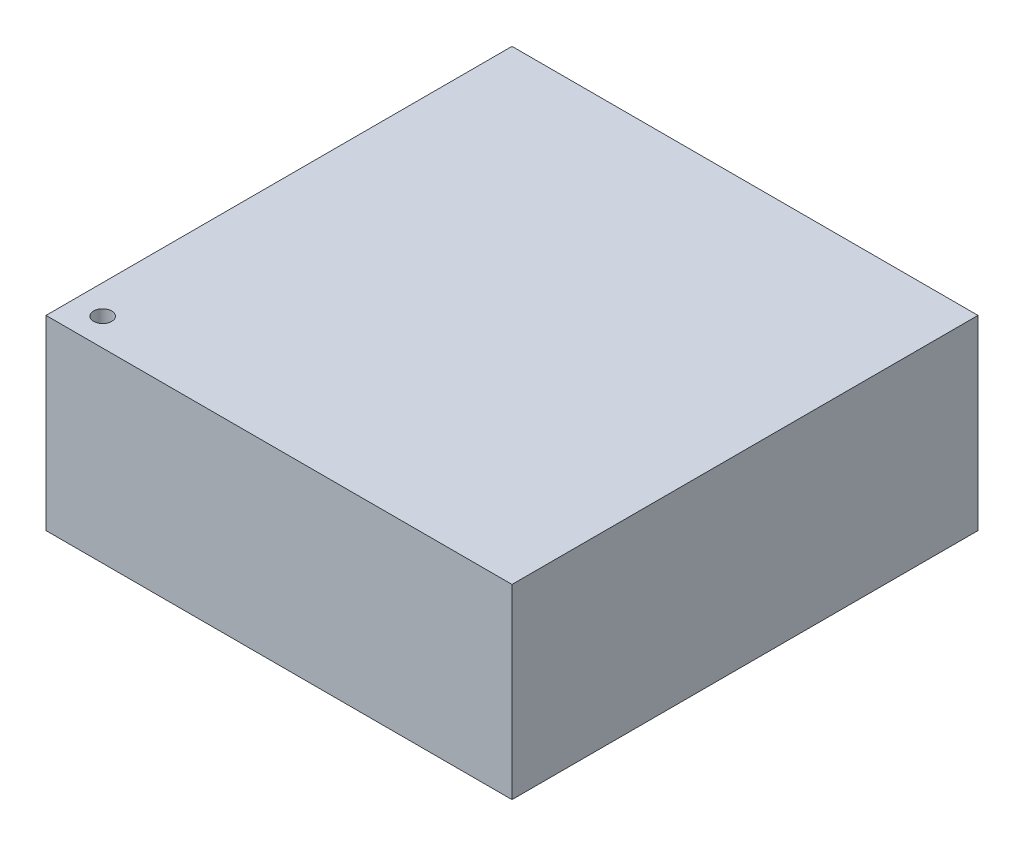
ISO-10303-21;
HEADER;
FILE_DESCRIPTION(('STEP AP214'),'2;1');
FILE_NAME('part.step','',(''),(''),'','','');
FILE_SCHEMA(('AUTOMOTIVE_DESIGN { 1 0 10303 214 1 1 1 1 }'));
ENDSEC;
DATA;
#1=APPLICATION_CONTEXT('core data for automotive mechanical design processes');
#2=APPLICATION_PROTOCOL_DEFINITION('international standard','automotive_design',2000,#1);
#3=PRODUCT_CONTEXT('',#1,'mechanical');
#4=PRODUCT('Part','Part','',(#3));
#5=PRODUCT_RELATED_PRODUCT_CATEGORY('part','',(#4));
#6=PRODUCT_DEFINITION_FORMATION('','',#4);
#7=PRODUCT_DEFINITION_CONTEXT('part definition',#1,'design');
#8=PRODUCT_DEFINITION('design','',#6,#7);
#9=PRODUCT_DEFINITION_SHAPE('','',#8);
#10=(LENGTH_UNIT() NAMED_UNIT(*) SI_UNIT(.MILLI.,.METRE.));
#11=(NAMED_UNIT(*) PLANE_ANGLE_UNIT() SI_UNIT($,.RADIAN.));
#12=(NAMED_UNIT(*) SI_UNIT($,.STERADIAN.) SOLID_ANGLE_UNIT());
#13=UNCERTAINTY_MEASURE_WITH_UNIT(LENGTH_MEASURE(1.E-05),#10,'distance_accuracy_value','');
#14=(GEOMETRIC_REPRESENTATION_CONTEXT(3) GLOBAL_UNCERTAINTY_ASSIGNED_CONTEXT((#13)) GLOBAL_UNIT_ASSIGNED_CONTEXT((#10,
#11,#12)) REPRESENTATION_CONTEXT('',''));
#15=CARTESIAN_POINT('',(0.,0.,0.));
#16=DIRECTION('',(0.,0.,1.));
#17=DIRECTION('',(1.,0.,0.));
#18=AXIS2_PLACEMENT_3D('',#15,#16,#17);
#19=CARTESIAN_POINT('',(65.,52.,-65.));
#20=DIRECTION('',(-1.,0.,0.));
#21=DIRECTION('',(0.,0.,1.));
#22=AXIS2_PLACEMENT_3D('',#19,#20,#21);
#23=PLANE('',#22);
#24=DIRECTION('',(0.,0.,-1.));
#25=VECTOR('',#24,1.);
#26=CARTESIAN_POINT('',(65.,0.,-65.));
#27=LINE('',#26,#25);
#28=CARTESIAN_POINT('',(65.,0.,65.));
#29=VERTEX_POINT('',#28);
#30=CARTESIAN_POINT('',(65.,0.,-65.));
#31=VERTEX_POINT('',#30);
#32=EDGE_CURVE('E112',#29,#31,#27,.T.);
#33=ORIENTED_EDGE('',*,*,#32,.T.);
#34=DIRECTION('',(0.,-1.,0.));
#35=VECTOR('',#34,1.);
#36=CARTESIAN_POINT('',(65.,52.,-65.));
#37=LINE('',#36,#35);
#38=CARTESIAN_POINT('',(65.,52.,-65.));
#39=VERTEX_POINT('',#38);
#40=EDGE_CURVE('E11',#39,#31,#37,.T.);
#41=ORIENTED_EDGE('',*,*,#40,.F.);
#42=DIRECTION('',(0.,0.,-1.));
#43=VECTOR('',#42,1.);
#44=CARTESIAN_POINT('',(65.,52.,-65.));
#45=LINE('',#44,#43);
#46=CARTESIAN_POINT('',(65.,52.,65.));
#47=VERTEX_POINT('',#46);
#48=EDGE_CURVE('E98',#47,#39,#45,.T.);
#49=ORIENTED_EDGE('',*,*,#48,.F.);
#50=DIRECTION('',(0.,-1.,0.));
#51=VECTOR('',#50,1.);
#52=CARTESIAN_POINT('',(65.,52.,65.));
#53=LINE('',#52,#51);
#54=EDGE_CURVE('E108',#47,#29,#53,.T.);
#55=ORIENTED_EDGE('',*,*,#54,.T.);
#56=EDGE_LOOP('',(#33,#41,#49,#55));
#57=FACE_BOUND('',#56,.T.);
#58=ADVANCED_FACE('F47',(#57),#23,.F.);
#59=CARTESIAN_POINT('',(-65.,52.,-65.));
#60=DIRECTION('',(0.,0.,1.));
#61=DIRECTION('',(1.,0.,0.));
#62=AXIS2_PLACEMENT_3D('',#59,#60,#61);
#63=PLANE('',#62);
#64=DIRECTION('',(-1.,0.,0.));
#65=VECTOR('',#64,1.);
#66=CARTESIAN_POINT('',(-65.,0.,-65.));
#67=LINE('',#66,#65);
#68=CARTESIAN_POINT('',(-65.,0.,-65.));
#69=VERTEX_POINT('',#68);
#70=EDGE_CURVE('E103',#31,#69,#67,.T.);
#71=ORIENTED_EDGE('',*,*,#70,.T.);
#72=DIRECTION('',(0.,-1.,0.));
#73=VECTOR('',#72,1.);
#74=CARTESIAN_POINT('',(-65.,52.,-65.));
#75=LINE('',#74,#73);
#76=CARTESIAN_POINT('',(-65.,52.,-65.));
#77=VERTEX_POINT('',#76);
#78=EDGE_CURVE('E55',#77,#69,#75,.T.);
#79=ORIENTED_EDGE('',*,*,#78,.F.);
#80=DIRECTION('',(-1.,0.,0.));
#81=VECTOR('',#80,1.);
#82=CARTESIAN_POINT('',(-65.,52.,-65.));
#83=LINE('',#82,#81);
#84=EDGE_CURVE('E93',#39,#77,#83,.T.);
#85=ORIENTED_EDGE('',*,*,#84,.F.);
#86=ORIENTED_EDGE('',*,*,#40,.T.);
#87=EDGE_LOOP('',(#71,#79,#85,#86));
#88=FACE_BOUND('',#87,.T.);
#89=ADVANCED_FACE('F102',(#88),#63,.F.);
#90=CARTESIAN_POINT('',(-65.,52.,-65.));
#91=DIRECTION('',(1.,0.,0.));
#92=DIRECTION('',(0.,0.,-1.));
#93=AXIS2_PLACEMENT_3D('',#90,#91,#92);
#94=PLANE('',#93);
#95=DIRECTION('',(0.,0.,1.));
#96=VECTOR('',#95,1.);
#97=CARTESIAN_POINT('',(-65.,0.,-65.));
#98=LINE('',#97,#96);
#99=CARTESIAN_POINT('',(-65.,0.,65.));
#100=VERTEX_POINT('',#99);
#101=EDGE_CURVE('E80',#69,#100,#98,.T.);
#102=ORIENTED_EDGE('',*,*,#101,.T.);
#103=DIRECTION('',(0.,-1.,0.));
#104=VECTOR('',#103,1.);
#105=CARTESIAN_POINT('',(-65.,52.,65.));
#106=LINE('',#105,#104);
#107=CARTESIAN_POINT('',(-65.,52.,65.));
#108=VERTEX_POINT('',#107);
#109=EDGE_CURVE('E104',#108,#100,#106,.T.);
#110=ORIENTED_EDGE('',*,*,#109,.F.);
#111=DIRECTION('',(0.,0.,1.));
#112=VECTOR('',#111,1.);
#113=CARTESIAN_POINT('',(-65.,52.,-65.));
#114=LINE('',#113,#112);
#115=EDGE_CURVE('E96',#77,#108,#114,.T.);
#116=ORIENTED_EDGE('',*,*,#115,.F.);
#117=ORIENTED_EDGE('',*,*,#78,.T.);
#118=EDGE_LOOP('',(#102,#110,#116,#117));
#119=FACE_BOUND('',#118,.T.);
#120=ADVANCED_FACE('F105',(#119),#94,.F.);
#121=CARTESIAN_POINT('',(-65.,52.,65.));
#122=DIRECTION('',(0.,0.,-1.));
#123=DIRECTION('',(-1.,0.,0.));
#124=AXIS2_PLACEMENT_3D('',#121,#122,#123);
#125=PLANE('',#124);
#126=DIRECTION('',(1.,0.,0.));
#127=VECTOR('',#126,1.);
#128=CARTESIAN_POINT('',(-65.,0.,65.));
#129=LINE('',#128,#127);
#130=EDGE_CURVE('E86',#100,#29,#129,.T.);
#131=ORIENTED_EDGE('',*,*,#130,.T.);
#132=ORIENTED_EDGE('',*,*,#54,.F.);
#133=DIRECTION('',(1.,0.,0.));
#134=VECTOR('',#133,1.);
#135=CARTESIAN_POINT('',(-65.,52.,65.));
#136=LINE('',#135,#134);
#137=EDGE_CURVE('E63',#108,#47,#136,.T.);
#138=ORIENTED_EDGE('',*,*,#137,.F.);
#139=ORIENTED_EDGE('',*,*,#109,.T.);
#140=EDGE_LOOP('',(#131,#132,#138,#139));
#141=FACE_BOUND('',#140,.T.);
#142=ADVANCED_FACE('F121',(#141),#125,.F.);
#143=CARTESIAN_POINT('',(0.,52.,0.));
#144=DIRECTION('',(0.,1.,0.));
#145=DIRECTION('',(0.,0.,1.));
#146=AXIS2_PLACEMENT_3D('',#143,#144,#145);
#147=PLANE('',#146);
#148=CARTESIAN_POINT('',(-56.9078618236471,52.,57.2900895157647));
#149=DIRECTION('',(0.,1.,0.));
#150=DIRECTION('',(0.,0.,1.));
#151=AXIS2_PLACEMENT_3D('',#148,#149,#150);
#152=CIRCLE('',#151,2.52723563584984);
#153=CARTESIAN_POINT('',(-56.9078618236471,52.,59.8173251516145));
#154=VERTEX_POINT('',#153);
#155=EDGE_CURVE('E127',#154,#154,#152,.T.);
#156=ORIENTED_EDGE('',*,*,#155,.F.);
#157=EDGE_LOOP('',(#156));
#158=FACE_BOUND('',#157,.T.);
#159=ORIENTED_EDGE('',*,*,#48,.T.);
#160=ORIENTED_EDGE('',*,*,#84,.T.);
#161=ORIENTED_EDGE('',*,*,#115,.T.);
#162=ORIENTED_EDGE('',*,*,#137,.T.);
#163=EDGE_LOOP('',(#159,#160,#161,#162));
#164=FACE_BOUND('',#163,.T.);
#165=ADVANCED_FACE('F94',(#158,#164),#147,.T.);
#166=CARTESIAN_POINT('',(0.,0.,0.));
#167=DIRECTION('',(0.,1.,0.));
#168=DIRECTION('',(0.,0.,1.));
#169=AXIS2_PLACEMENT_3D('',#166,#167,#168);
#170=PLANE('',#169);
#171=ORIENTED_EDGE('',*,*,#32,.F.);
#172=ORIENTED_EDGE('',*,*,#130,.F.);
#173=ORIENTED_EDGE('',*,*,#101,.F.);
#174=ORIENTED_EDGE('',*,*,#70,.F.);
#175=EDGE_LOOP('',(#171,#172,#173,#174));
#176=FACE_BOUND('',#175,.T.);
#177=ADVANCED_FACE('F124',(#176),#170,.F.);
#178=CARTESIAN_POINT('',(-56.9078618236471,42.,57.2900895157647));
#179=DIRECTION('',(0.,1.,0.));
#180=DIRECTION('',(0.,0.,1.));
#181=AXIS2_PLACEMENT_3D('',#178,#179,#180);
#182=CYLINDRICAL_SURFACE('',#181,2.52723563584984);
#183=CARTESIAN_POINT('',(-56.9078618236471,42.,57.2900895157647));
#184=DIRECTION('',(0.,1.,0.));
#185=DIRECTION('',(0.,0.,1.));
#186=AXIS2_PLACEMENT_3D('',#183,#184,#185);
#187=CIRCLE('',#186,2.52723563584984);
#188=CARTESIAN_POINT('',(-56.9078618236471,42.,59.8173251516145));
#189=VERTEX_POINT('',#188);
#190=EDGE_CURVE('E115',#189,#189,#187,.T.);
#191=ORIENTED_EDGE('',*,*,#190,.F.);
#192=EDGE_LOOP('',(#191));
#193=FACE_BOUND('',#192,.T.);
#194=ORIENTED_EDGE('',*,*,#155,.T.);
#195=EDGE_LOOP('',(#194));
#196=FACE_BOUND('',#195,.T.);
#197=ADVANCED_FACE('F135',(#193,#196),#182,.F.);
#198=CARTESIAN_POINT('',(-56.9078618236471,42.,57.2900895157647));
#199=DIRECTION('',(0.,1.,0.));
#200=DIRECTION('',(0.,0.,1.));
#201=AXIS2_PLACEMENT_3D('',#198,#199,#200);
#202=PLANE('',#201);
#203=ORIENTED_EDGE('',*,*,#190,.T.);
#204=EDGE_LOOP('',(#203));
#205=FACE_BOUND('',#204,.T.);
#206=ADVANCED_FACE('F133',(#205),#202,.T.);
#207=CLOSED_SHELL('',(#58,#89,#120,#142,#165,#177,#197,#206));
#208=MANIFOLD_SOLID_BREP('B2',#207);
#209=ADVANCED_BREP_SHAPE_REPRESENTATION('',(#18,#208),#14);
#210=SHAPE_DEFINITION_REPRESENTATION(#9,#209);
ENDSEC;
END-ISO-10303-21;
